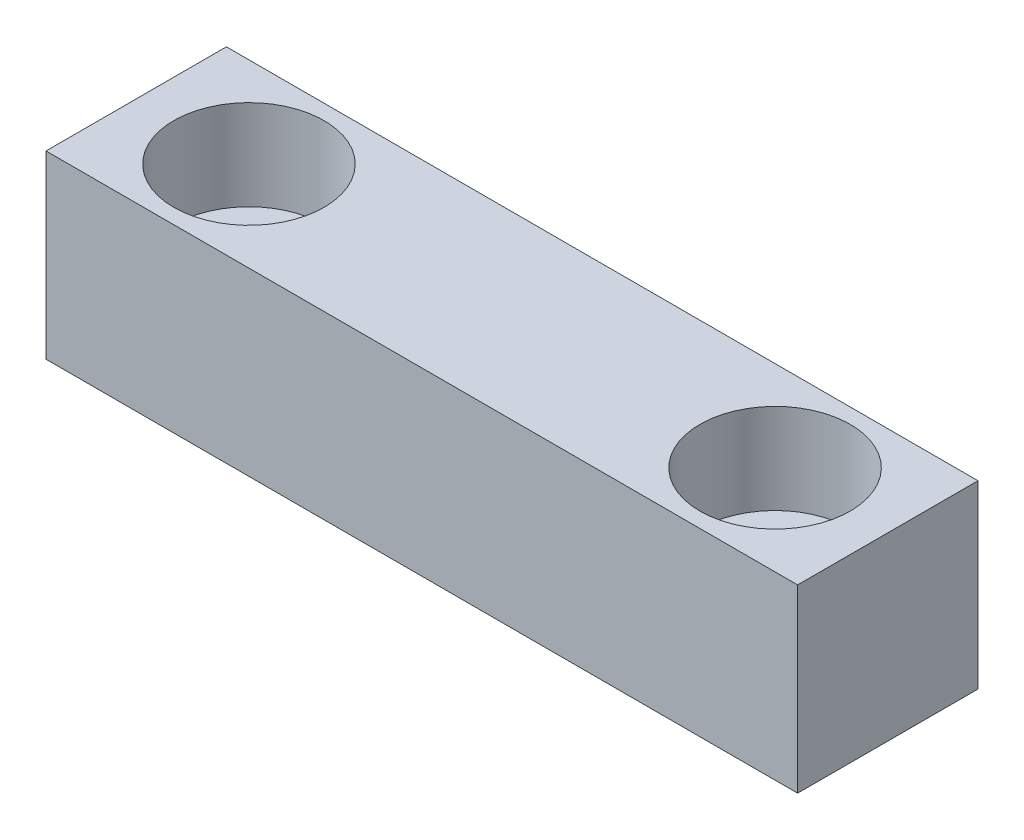
ISO-10303-21;
HEADER;
FILE_DESCRIPTION(('STEP AP214'),'2;1');
FILE_NAME('part.step','',(''),(''),'','','');
FILE_SCHEMA(('AUTOMOTIVE_DESIGN { 1 0 10303 214 1 1 1 1 }'));
ENDSEC;
DATA;
#1=APPLICATION_CONTEXT('core data for automotive mechanical design processes');
#2=APPLICATION_PROTOCOL_DEFINITION('international standard','automotive_design',2000,#1);
#3=PRODUCT_CONTEXT('',#1,'mechanical');
#4=PRODUCT('Part','Part','',(#3));
#5=PRODUCT_RELATED_PRODUCT_CATEGORY('part','',(#4));
#6=PRODUCT_DEFINITION_FORMATION('','',#4);
#7=PRODUCT_DEFINITION_CONTEXT('part definition',#1,'design');
#8=PRODUCT_DEFINITION('design','',#6,#7);
#9=PRODUCT_DEFINITION_SHAPE('','',#8);
#10=(LENGTH_UNIT() NAMED_UNIT(*) SI_UNIT(.MILLI.,.METRE.));
#11=(NAMED_UNIT(*) PLANE_ANGLE_UNIT() SI_UNIT($,.RADIAN.));
#12=(NAMED_UNIT(*) SI_UNIT($,.STERADIAN.) SOLID_ANGLE_UNIT());
#13=UNCERTAINTY_MEASURE_WITH_UNIT(LENGTH_MEASURE(1.E-05),#10,'distance_accuracy_value','');
#14=(GEOMETRIC_REPRESENTATION_CONTEXT(3) GLOBAL_UNCERTAINTY_ASSIGNED_CONTEXT((#13)) GLOBAL_UNIT_ASSIGNED_CONTEXT((#10,
#11,#12)) REPRESENTATION_CONTEXT('',''));
#15=CARTESIAN_POINT('',(0.,0.,0.));
#16=DIRECTION('',(0.,0.,1.));
#17=DIRECTION('',(1.,0.,0.));
#18=AXIS2_PLACEMENT_3D('',#15,#16,#17);
#19=CARTESIAN_POINT('',(0.,6.,0.));
#20=DIRECTION('',(1.,0.,0.));
#21=DIRECTION('',(0.,0.,-1.));
#22=AXIS2_PLACEMENT_3D('',#19,#20,#21);
#23=PLANE('',#22);
#24=DIRECTION('',(0.,0.,1.));
#25=VECTOR('',#24,1.);
#26=CARTESIAN_POINT('',(0.,-6.,0.));
#27=LINE('',#26,#25);
#28=CARTESIAN_POINT('',(0.,-6.,-12.));
#29=VERTEX_POINT('',#28);
#30=CARTESIAN_POINT('',(0.,-6.,0.));
#31=VERTEX_POINT('',#30);
#32=EDGE_CURVE('E107',#29,#31,#27,.T.);
#33=ORIENTED_EDGE('',*,*,#32,.T.);
#34=DIRECTION('',(0.,-1.,0.));
#35=VECTOR('',#34,1.);
#36=CARTESIAN_POINT('',(0.,6.,0.));
#37=LINE('',#36,#35);
#38=CARTESIAN_POINT('',(0.,6.,0.));
#39=VERTEX_POINT('',#38);
#40=EDGE_CURVE('E11',#39,#31,#37,.T.);
#41=ORIENTED_EDGE('',*,*,#40,.F.);
#42=DIRECTION('',(0.,0.,1.));
#43=VECTOR('',#42,1.);
#44=CARTESIAN_POINT('',(0.,6.,0.));
#45=LINE('',#44,#43);
#46=CARTESIAN_POINT('',(0.,6.,-12.));
#47=VERTEX_POINT('',#46);
#48=EDGE_CURVE('E91',#47,#39,#45,.T.);
#49=ORIENTED_EDGE('',*,*,#48,.F.);
#50=DIRECTION('',(0.,-1.,0.));
#51=VECTOR('',#50,1.);
#52=CARTESIAN_POINT('',(0.,6.,-12.));
#53=LINE('',#52,#51);
#54=EDGE_CURVE('E103',#47,#29,#53,.T.);
#55=ORIENTED_EDGE('',*,*,#54,.T.);
#56=EDGE_LOOP('',(#33,#41,#49,#55));
#57=FACE_BOUND('',#56,.T.);
#58=ADVANCED_FACE('F39',(#57),#23,.F.);
#59=CARTESIAN_POINT('',(0.,6.,0.));
#60=DIRECTION('',(0.,0.,-1.));
#61=DIRECTION('',(-1.,0.,0.));
#62=AXIS2_PLACEMENT_3D('',#59,#60,#61);
#63=PLANE('',#62);
#64=DIRECTION('',(1.,0.,0.));
#65=VECTOR('',#64,1.);
#66=CARTESIAN_POINT('',(0.,-6.,0.));
#67=LINE('',#66,#65);
#68=CARTESIAN_POINT('',(50.,-6.,0.));
#69=VERTEX_POINT('',#68);
#70=EDGE_CURVE('E96',#31,#69,#67,.T.);
#71=ORIENTED_EDGE('',*,*,#70,.T.);
#72=DIRECTION('',(0.,-1.,0.));
#73=VECTOR('',#72,1.);
#74=CARTESIAN_POINT('',(50.,6.,0.));
#75=LINE('',#74,#73);
#76=CARTESIAN_POINT('',(50.,6.,0.));
#77=VERTEX_POINT('',#76);
#78=EDGE_CURVE('E48',#77,#69,#75,.T.);
#79=ORIENTED_EDGE('',*,*,#78,.F.);
#80=DIRECTION('',(1.,0.,0.));
#81=VECTOR('',#80,1.);
#82=CARTESIAN_POINT('',(0.,6.,0.));
#83=LINE('',#82,#81);
#84=EDGE_CURVE('E86',#39,#77,#83,.T.);
#85=ORIENTED_EDGE('',*,*,#84,.F.);
#86=ORIENTED_EDGE('',*,*,#40,.T.);
#87=EDGE_LOOP('',(#71,#79,#85,#86));
#88=FACE_BOUND('',#87,.T.);
#89=ADVANCED_FACE('F95',(#88),#63,.F.);
#90=CARTESIAN_POINT('',(50.,6.,0.));
#91=DIRECTION('',(-1.,0.,0.));
#92=DIRECTION('',(0.,0.,1.));
#93=AXIS2_PLACEMENT_3D('',#90,#91,#92);
#94=PLANE('',#93);
#95=DIRECTION('',(0.,0.,-1.));
#96=VECTOR('',#95,1.);
#97=CARTESIAN_POINT('',(50.,-6.,0.));
#98=LINE('',#97,#96);
#99=CARTESIAN_POINT('',(50.,-6.,-12.));
#100=VERTEX_POINT('',#99);
#101=EDGE_CURVE('E73',#69,#100,#98,.T.);
#102=ORIENTED_EDGE('',*,*,#101,.T.);
#103=DIRECTION('',(0.,-1.,0.));
#104=VECTOR('',#103,1.);
#105=CARTESIAN_POINT('',(50.,6.,-12.));
#106=LINE('',#105,#104);
#107=CARTESIAN_POINT('',(50.,6.,-12.));
#108=VERTEX_POINT('',#107);
#109=EDGE_CURVE('E98',#108,#100,#106,.T.);
#110=ORIENTED_EDGE('',*,*,#109,.F.);
#111=DIRECTION('',(0.,0.,-1.));
#112=VECTOR('',#111,1.);
#113=CARTESIAN_POINT('',(50.,6.,0.));
#114=LINE('',#113,#112);
#115=EDGE_CURVE('E89',#77,#108,#114,.T.);
#116=ORIENTED_EDGE('',*,*,#115,.F.);
#117=ORIENTED_EDGE('',*,*,#78,.T.);
#118=EDGE_LOOP('',(#102,#110,#116,#117));
#119=FACE_BOUND('',#118,.T.);
#120=ADVANCED_FACE('F99',(#119),#94,.F.);
#121=CARTESIAN_POINT('',(0.,6.,-12.));
#122=DIRECTION('',(0.,0.,1.));
#123=DIRECTION('',(1.,0.,0.));
#124=AXIS2_PLACEMENT_3D('',#121,#122,#123);
#125=PLANE('',#124);
#126=DIRECTION('',(-1.,0.,0.));
#127=VECTOR('',#126,1.);
#128=CARTESIAN_POINT('',(0.,-6.,-12.));
#129=LINE('',#128,#127);
#130=EDGE_CURVE('E79',#100,#29,#129,.T.);
#131=ORIENTED_EDGE('',*,*,#130,.T.);
#132=ORIENTED_EDGE('',*,*,#54,.F.);
#133=DIRECTION('',(-1.,0.,0.));
#134=VECTOR('',#133,1.);
#135=CARTESIAN_POINT('',(0.,6.,-12.));
#136=LINE('',#135,#134);
#137=EDGE_CURVE('E56',#108,#47,#136,.T.);
#138=ORIENTED_EDGE('',*,*,#137,.F.);
#139=ORIENTED_EDGE('',*,*,#109,.T.);
#140=EDGE_LOOP('',(#131,#132,#138,#139));
#141=FACE_BOUND('',#140,.T.);
#142=ADVANCED_FACE('F121',(#141),#125,.F.);
#143=CARTESIAN_POINT('',(0.,6.,0.));
#144=DIRECTION('',(0.,-1.,0.));
#145=DIRECTION('',(0.,0.,-1.));
#146=AXIS2_PLACEMENT_3D('',#143,#144,#145);
#147=PLANE('',#146);
#148=CARTESIAN_POINT('',(42.5,6.,-6.));
#149=DIRECTION('',(0.,1.,0.));
#150=DIRECTION('',(0.,0.,1.));
#151=AXIS2_PLACEMENT_3D('',#148,#149,#150);
#152=CIRCLE('',#151,5.);
#153=CARTESIAN_POINT('',(42.5,6.,-1.));
#154=VERTEX_POINT('',#153);
#155=EDGE_CURVE('E155',#154,#154,#152,.T.);
#156=ORIENTED_EDGE('',*,*,#155,.F.);
#157=EDGE_LOOP('',(#156));
#158=FACE_BOUND('',#157,.T.);
#159=CARTESIAN_POINT('',(7.5,6.,-6.));
#160=DIRECTION('',(0.,1.,0.));
#161=DIRECTION('',(0.,0.,1.));
#162=AXIS2_PLACEMENT_3D('',#159,#160,#161);
#163=CIRCLE('',#162,5.);
#164=CARTESIAN_POINT('',(7.5,6.,-0.999999999999999));
#165=VERTEX_POINT('',#164);
#166=EDGE_CURVE('E139',#165,#165,#163,.T.);
#167=ORIENTED_EDGE('',*,*,#166,.F.);
#168=EDGE_LOOP('',(#167));
#169=FACE_BOUND('',#168,.T.);
#170=ORIENTED_EDGE('',*,*,#48,.T.);
#171=ORIENTED_EDGE('',*,*,#84,.T.);
#172=ORIENTED_EDGE('',*,*,#115,.T.);
#173=ORIENTED_EDGE('',*,*,#137,.T.);
#174=EDGE_LOOP('',(#170,#171,#172,#173));
#175=FACE_BOUND('',#174,.T.);
#176=ADVANCED_FACE('F87',(#158,#169,#175),#147,.F.);
#177=CARTESIAN_POINT('',(0.,-6.,0.));
#178=DIRECTION('',(0.,-1.,0.));
#179=DIRECTION('',(0.,0.,-1.));
#180=AXIS2_PLACEMENT_3D('',#177,#178,#179);
#181=PLANE('',#180);
#182=CARTESIAN_POINT('',(42.5,-6.,-6.));
#183=DIRECTION('',(0.,1.,0.));
#184=DIRECTION('',(0.,0.,1.));
#185=AXIS2_PLACEMENT_3D('',#182,#183,#184);
#186=CIRCLE('',#185,2.75);
#187=CARTESIAN_POINT('',(42.5,-6.,-3.25));
#188=VERTEX_POINT('',#187);
#189=EDGE_CURVE('E143',#188,#188,#186,.T.);
#190=ORIENTED_EDGE('',*,*,#189,.T.);
#191=EDGE_LOOP('',(#190));
#192=FACE_BOUND('',#191,.T.);
#193=CARTESIAN_POINT('',(7.5,-6.,-6.));
#194=DIRECTION('',(0.,1.,0.));
#195=DIRECTION('',(0.,0.,1.));
#196=AXIS2_PLACEMENT_3D('',#193,#194,#195);
#197=CIRCLE('',#196,2.75);
#198=CARTESIAN_POINT('',(7.5,-6.,-3.25));
#199=VERTEX_POINT('',#198);
#200=EDGE_CURVE('E111',#199,#199,#197,.T.);
#201=ORIENTED_EDGE('',*,*,#200,.T.);
#202=EDGE_LOOP('',(#201));
#203=FACE_BOUND('',#202,.T.);
#204=ORIENTED_EDGE('',*,*,#32,.F.);
#205=ORIENTED_EDGE('',*,*,#130,.F.);
#206=ORIENTED_EDGE('',*,*,#101,.F.);
#207=ORIENTED_EDGE('',*,*,#70,.F.);
#208=EDGE_LOOP('',(#204,#205,#206,#207));
#209=FACE_BOUND('',#208,.T.);
#210=ADVANCED_FACE('F124',(#192,#203,#209),#181,.T.);
#211=CARTESIAN_POINT('',(7.5,6.,-6.));
#212=DIRECTION('',(0.,1.,0.));
#213=DIRECTION('',(0.,0.,1.));
#214=AXIS2_PLACEMENT_3D('',#211,#212,#213);
#215=CYLINDRICAL_SURFACE('',#214,2.75);
#216=ORIENTED_EDGE('',*,*,#200,.F.);
#217=EDGE_LOOP('',(#216));
#218=FACE_BOUND('',#217,.T.);
#219=CARTESIAN_POINT('',(7.5,0.,-6.));
#220=DIRECTION('',(0.,1.,0.));
#221=DIRECTION('',(0.,0.,1.));
#222=AXIS2_PLACEMENT_3D('',#219,#220,#221);
#223=CIRCLE('',#222,2.75);
#224=CARTESIAN_POINT('',(7.5,0.,-3.25));
#225=VERTEX_POINT('',#224);
#226=EDGE_CURVE('E131',#225,#225,#223,.T.);
#227=ORIENTED_EDGE('',*,*,#226,.T.);
#228=EDGE_LOOP('',(#227));
#229=FACE_BOUND('',#228,.T.);
#230=ADVANCED_FACE('F180',(#218,#229),#215,.F.);
#231=CARTESIAN_POINT('',(10.25,0.,-6.));
#232=DIRECTION('',(0.,-1.,0.));
#233=DIRECTION('',(0.,0.,-1.));
#234=AXIS2_PLACEMENT_3D('',#231,#232,#233);
#235=PLANE('',#234);
#236=ORIENTED_EDGE('',*,*,#226,.F.);
#237=EDGE_LOOP('',(#236));
#238=FACE_BOUND('',#237,.T.);
#239=CARTESIAN_POINT('',(7.5,0.,-6.));
#240=DIRECTION('',(0.,1.,0.));
#241=DIRECTION('',(0.,0.,1.));
#242=AXIS2_PLACEMENT_3D('',#239,#240,#241);
#243=CIRCLE('',#242,5.);
#244=CARTESIAN_POINT('',(7.5,0.,-1.));
#245=VERTEX_POINT('',#244);
#246=EDGE_CURVE('E135',#245,#245,#243,.T.);
#247=ORIENTED_EDGE('',*,*,#246,.T.);
#248=EDGE_LOOP('',(#247));
#249=FACE_BOUND('',#248,.T.);
#250=ADVANCED_FACE('F170',(#238,#249),#235,.F.);
#251=CARTESIAN_POINT('',(7.5,6.,-6.));
#252=DIRECTION('',(0.,1.,0.));
#253=DIRECTION('',(0.,0.,1.));
#254=AXIS2_PLACEMENT_3D('',#251,#252,#253);
#255=CYLINDRICAL_SURFACE('',#254,5.);
#256=ORIENTED_EDGE('',*,*,#246,.F.);
#257=EDGE_LOOP('',(#256));
#258=FACE_BOUND('',#257,.T.);
#259=ORIENTED_EDGE('',*,*,#166,.T.);
#260=EDGE_LOOP('',(#259));
#261=FACE_BOUND('',#260,.T.);
#262=ADVANCED_FACE('F167',(#258,#261),#255,.F.);
#263=CARTESIAN_POINT('',(42.5,6.,-6.));
#264=DIRECTION('',(0.,1.,0.));
#265=DIRECTION('',(0.,0.,1.));
#266=AXIS2_PLACEMENT_3D('',#263,#264,#265);
#267=CYLINDRICAL_SURFACE('',#266,2.75);
#268=ORIENTED_EDGE('',*,*,#189,.F.);
#269=EDGE_LOOP('',(#268));
#270=FACE_BOUND('',#269,.T.);
#271=CARTESIAN_POINT('',(42.5,0.,-6.));
#272=DIRECTION('',(0.,1.,0.));
#273=DIRECTION('',(0.,0.,1.));
#274=AXIS2_PLACEMENT_3D('',#271,#272,#273);
#275=CIRCLE('',#274,2.75);
#276=CARTESIAN_POINT('',(42.5,0.,-3.25));
#277=VERTEX_POINT('',#276);
#278=EDGE_CURVE('E147',#277,#277,#275,.T.);
#279=ORIENTED_EDGE('',*,*,#278,.T.);
#280=EDGE_LOOP('',(#279));
#281=FACE_BOUND('',#280,.T.);
#282=ADVANCED_FACE('F169',(#270,#281),#267,.F.);
#283=CARTESIAN_POINT('',(45.25,0.,-6.));
#284=DIRECTION('',(0.,-1.,0.));
#285=DIRECTION('',(0.,0.,-1.));
#286=AXIS2_PLACEMENT_3D('',#283,#284,#285);
#287=PLANE('',#286);
#288=ORIENTED_EDGE('',*,*,#278,.F.);
#289=EDGE_LOOP('',(#288));
#290=FACE_BOUND('',#289,.T.);
#291=CARTESIAN_POINT('',(42.5,0.,-6.));
#292=DIRECTION('',(0.,1.,0.));
#293=DIRECTION('',(0.,0.,1.));
#294=AXIS2_PLACEMENT_3D('',#291,#292,#293);
#295=CIRCLE('',#294,5.);
#296=CARTESIAN_POINT('',(42.5,0.,-1.));
#297=VERTEX_POINT('',#296);
#298=EDGE_CURVE('E151',#297,#297,#295,.T.);
#299=ORIENTED_EDGE('',*,*,#298,.T.);
#300=EDGE_LOOP('',(#299));
#301=FACE_BOUND('',#300,.T.);
#302=ADVANCED_FACE('F177',(#290,#301),#287,.F.);
#303=CARTESIAN_POINT('',(42.5,6.,-6.));
#304=DIRECTION('',(0.,1.,0.));
#305=DIRECTION('',(0.,0.,1.));
#306=AXIS2_PLACEMENT_3D('',#303,#304,#305);
#307=CYLINDRICAL_SURFACE('',#306,5.);
#308=ORIENTED_EDGE('',*,*,#298,.F.);
#309=EDGE_LOOP('',(#308));
#310=FACE_BOUND('',#309,.T.);
#311=ORIENTED_EDGE('',*,*,#155,.T.);
#312=EDGE_LOOP('',(#311));
#313=FACE_BOUND('',#312,.T.);
#314=ADVANCED_FACE('F160',(#310,#313),#307,.F.);
#315=CLOSED_SHELL('',(#58,#89,#120,#142,#176,#210,#230,#250,#262,#282,#302,#314));
#316=MANIFOLD_SOLID_BREP('B2',#315);
#317=ADVANCED_BREP_SHAPE_REPRESENTATION('',(#18,#316),#14);
#318=SHAPE_DEFINITION_REPRESENTATION(#9,#317);
ENDSEC;
END-ISO-10303-21;
